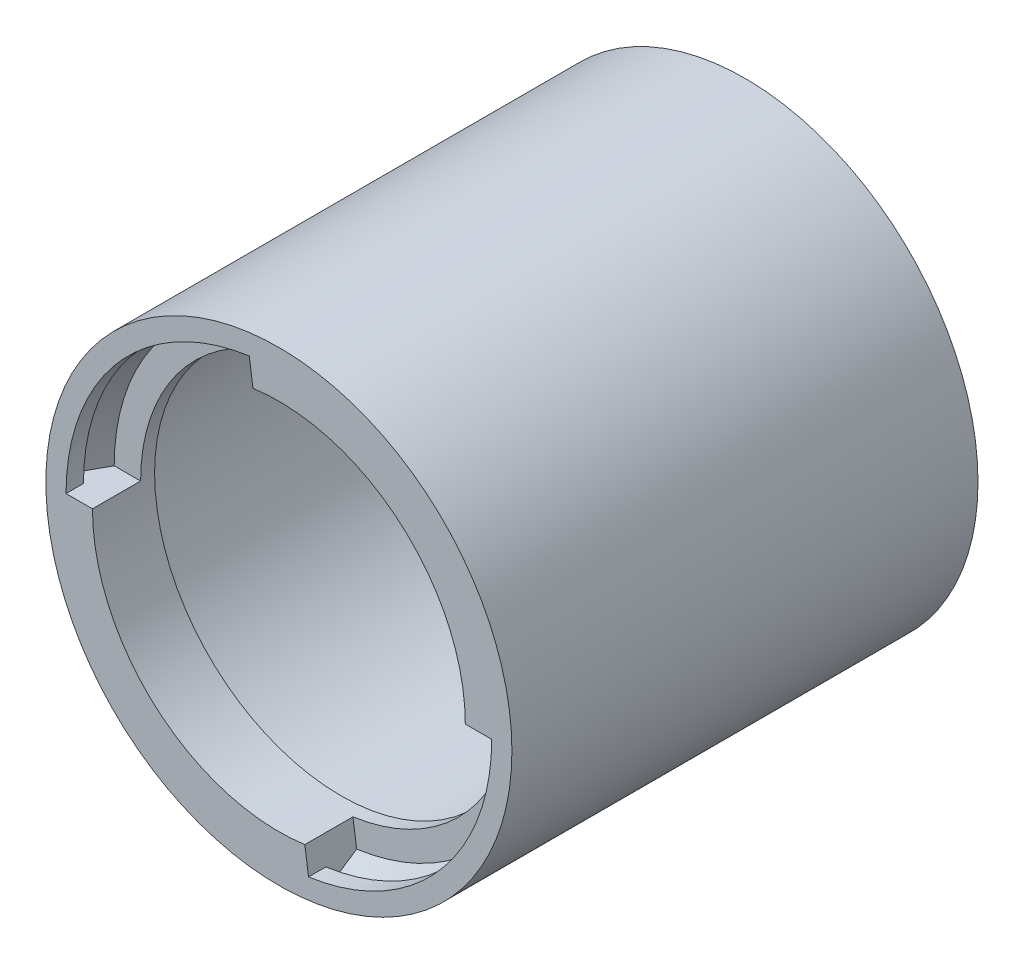
ISO-10303-21;
HEADER;
FILE_DESCRIPTION(('STEP AP214'),'2;1');
FILE_NAME('part.step','',(''),(''),'','','');
FILE_SCHEMA(('AUTOMOTIVE_DESIGN { 1 0 10303 214 1 1 1 1 }'));
ENDSEC;
DATA;
#1=APPLICATION_CONTEXT('core data for automotive mechanical design processes');
#2=APPLICATION_PROTOCOL_DEFINITION('international standard','automotive_design',2000,#1);
#3=PRODUCT_CONTEXT('',#1,'mechanical');
#4=PRODUCT('Part','Part','',(#3));
#5=PRODUCT_RELATED_PRODUCT_CATEGORY('part','',(#4));
#6=PRODUCT_DEFINITION_FORMATION('','',#4);
#7=PRODUCT_DEFINITION_CONTEXT('part definition',#1,'design');
#8=PRODUCT_DEFINITION('design','',#6,#7);
#9=PRODUCT_DEFINITION_SHAPE('','',#8);
#10=(LENGTH_UNIT() NAMED_UNIT(*) SI_UNIT(.MILLI.,.METRE.));
#11=(NAMED_UNIT(*) PLANE_ANGLE_UNIT() SI_UNIT($,.RADIAN.));
#12=(NAMED_UNIT(*) SI_UNIT($,.STERADIAN.) SOLID_ANGLE_UNIT());
#13=UNCERTAINTY_MEASURE_WITH_UNIT(LENGTH_MEASURE(1.E-05),#10,'distance_accuracy_value','');
#14=(GEOMETRIC_REPRESENTATION_CONTEXT(3) GLOBAL_UNCERTAINTY_ASSIGNED_CONTEXT((#13)) GLOBAL_UNIT_ASSIGNED_CONTEXT((#10,
#11,#12)) REPRESENTATION_CONTEXT('',''));
#15=CARTESIAN_POINT('',(0.,0.,0.));
#16=DIRECTION('',(0.,0.,1.));
#17=DIRECTION('',(1.,0.,0.));
#18=AXIS2_PLACEMENT_3D('',#15,#16,#17);
#19=CARTESIAN_POINT('',(0.,0.,26.));
#20=DIRECTION('',(0.,0.,1.));
#21=DIRECTION('',(1.,0.,0.));
#22=AXIS2_PLACEMENT_3D('',#19,#20,#21);
#23=CYLINDRICAL_SURFACE('',#22,12.);
#24=CARTESIAN_POINT('',(0.,0.,26.));
#25=DIRECTION('',(0.,0.,1.));
#26=DIRECTION('',(1.,0.,0.));
#27=AXIS2_PLACEMENT_3D('',#24,#25,#26);
#28=CIRCLE('',#27,12.);
#29=CARTESIAN_POINT('',(12.,0.,26.));
#30=VERTEX_POINT('',#29);
#31=EDGE_CURVE('E247',#30,#30,#28,.T.);
#32=ORIENTED_EDGE('',*,*,#31,.F.);
#33=EDGE_LOOP('',(#32));
#34=FACE_BOUND('',#33,.T.);
#35=DIRECTION('',(0.,0.,1.));
#36=VECTOR('',#35,1.);
#37=CARTESIAN_POINT('',(12.,0.,26.));
#38=LINE('',#37,#36);
#39=CARTESIAN_POINT('',(12.,0.,30.));
#40=VERTEX_POINT('',#39);
#41=CARTESIAN_POINT('',(12.,0.,26.9));
#42=VERTEX_POINT('',#41);
#43=EDGE_CURVE('E197',#40,#42,#38,.F.);
#44=ORIENTED_EDGE('',*,*,#43,.F.);
#45=CARTESIAN_POINT('',(0.,0.,30.));
#46=DIRECTION('',(0.,0.,1.));
#47=DIRECTION('',(1.,0.,0.));
#48=AXIS2_PLACEMENT_3D('',#45,#46,#47);
#49=CIRCLE('',#48,12.);
#50=CARTESIAN_POINT('',(-1.67007721152075,11.8832168248989,30.));
#51=VERTEX_POINT('',#50);
#52=EDGE_CURVE('E153',#40,#51,#49,.T.);
#53=ORIENTED_EDGE('',*,*,#52,.T.);
#54=DIRECTION('',(0.,0.,1.));
#55=VECTOR('',#54,1.);
#56=CARTESIAN_POINT('',(-1.67007721152075,11.8832168248989,26.));
#57=LINE('',#56,#55);
#58=CARTESIAN_POINT('',(-1.67007721152075,11.8832168248989,26.9));
#59=VERTEX_POINT('',#58);
#60=EDGE_CURVE('E158',#59,#51,#57,.T.);
#61=ORIENTED_EDGE('',*,*,#60,.F.);
#62=CARTESIAN_POINT('',(0.,0.,26.9));
#63=DIRECTION('',(0.,0.,1.));
#64=DIRECTION('',(1.,0.,0.));
#65=AXIS2_PLACEMENT_3D('',#62,#63,#64);
#66=CIRCLE('',#65,12.);
#67=CARTESIAN_POINT('',(-12.,0.,26.9));
#68=VERTEX_POINT('',#67);
#69=EDGE_CURVE('E268',#68,#59,#66,.F.);
#70=ORIENTED_EDGE('',*,*,#69,.F.);
#71=DIRECTION('',(0.,0.,1.));
#72=VECTOR('',#71,1.);
#73=CARTESIAN_POINT('',(-12.,0.,26.));
#74=LINE('',#73,#72);
#75=CARTESIAN_POINT('',(-12.,0.,30.));
#76=VERTEX_POINT('',#75);
#77=EDGE_CURVE('E274',#68,#76,#74,.T.);
#78=ORIENTED_EDGE('',*,*,#77,.T.);
#79=CARTESIAN_POINT('',(1.67007721152067,-11.8832168248989,30.));
#80=VERTEX_POINT('',#79);
#81=EDGE_CURVE('E252',#76,#80,#49,.T.);
#82=ORIENTED_EDGE('',*,*,#81,.T.);
#83=DIRECTION('',(0.,0.,1.));
#84=VECTOR('',#83,1.);
#85=CARTESIAN_POINT('',(1.67007721152068,-11.8832168248989,26.));
#86=LINE('',#85,#84);
#87=CARTESIAN_POINT('',(1.67007721152067,-11.8832168248989,26.9));
#88=VERTEX_POINT('',#87);
#89=EDGE_CURVE('E193',#80,#88,#86,.F.);
#90=ORIENTED_EDGE('',*,*,#89,.T.);
#91=CARTESIAN_POINT('',(0.,0.,26.9));
#92=DIRECTION('',(0.,0.,1.));
#93=DIRECTION('',(1.,0.,0.));
#94=AXIS2_PLACEMENT_3D('',#91,#92,#93);
#95=CIRCLE('',#94,12.);
#96=EDGE_CURVE('E11',#42,#88,#95,.F.);
#97=ORIENTED_EDGE('',*,*,#96,.F.);
#98=EDGE_LOOP('',(#44,#53,#61,#70,#78,#82,#90,#97));
#99=FACE_BOUND('',#98,.T.);
#100=ADVANCED_FACE('F43',(#34,#99),#23,.F.);
#101=CARTESIAN_POINT('',(0.,0.,30.));
#102=DIRECTION('',(0.,0.,-1.));
#103=DIRECTION('',(-1.,0.,0.));
#104=AXIS2_PLACEMENT_3D('',#101,#102,#103);
#105=CYLINDRICAL_SURFACE('',#104,13.5);
#106=CARTESIAN_POINT('',(0.,0.,0.));
#107=DIRECTION('',(0.,0.,1.));
#108=DIRECTION('',(1.,0.,0.));
#109=AXIS2_PLACEMENT_3D('',#106,#107,#108);
#110=CIRCLE('',#109,13.5);
#111=CARTESIAN_POINT('',(13.5,0.,0.));
#112=VERTEX_POINT('',#111);
#113=EDGE_CURVE('E259',#112,#112,#110,.T.);
#114=ORIENTED_EDGE('',*,*,#113,.F.);
#115=EDGE_LOOP('',(#114));
#116=FACE_BOUND('',#115,.T.);
#117=CARTESIAN_POINT('',(0.,0.,26.));
#118=DIRECTION('',(0.,0.,1.));
#119=DIRECTION('',(1.,0.,0.));
#120=AXIS2_PLACEMENT_3D('',#117,#118,#119);
#121=CIRCLE('',#120,13.5);
#122=CARTESIAN_POINT('',(13.5,0.,26.));
#123=VERTEX_POINT('',#122);
#124=EDGE_CURVE('E251',#123,#123,#121,.T.);
#125=ORIENTED_EDGE('',*,*,#124,.T.);
#126=EDGE_LOOP('',(#125));
#127=FACE_BOUND('',#126,.T.);
#128=ADVANCED_FACE('F326',(#116,#127),#105,.F.);
#129=CARTESIAN_POINT('',(0.,0.,30.));
#130=DIRECTION('',(0.,0.,1.));
#131=DIRECTION('',(1.,0.,0.));
#132=AXIS2_PLACEMENT_3D('',#129,#130,#131);
#133=PLANE('',#132);
#134=ORIENTED_EDGE('',*,*,#52,.F.);
#135=DIRECTION('',(-1.,0.,0.));
#136=VECTOR('',#135,1.);
#137=CARTESIAN_POINT('',(11.7,0.,30.));
#138=LINE('',#137,#136);
#139=CARTESIAN_POINT('',(13.7,0.,30.));
#140=VERTEX_POINT('',#139);
#141=EDGE_CURVE('E52',#40,#140,#138,.F.);
#142=ORIENTED_EDGE('',*,*,#141,.T.);
#143=CARTESIAN_POINT('',(0.,0.,30.));
#144=DIRECTION('',(0.,0.,-1.));
#145=DIRECTION('',(1.,0.,0.));
#146=AXIS2_PLACEMENT_3D('',#143,#144,#145);
#147=CIRCLE('',#146,13.7);
#148=CARTESIAN_POINT('',(1.90667148315277,-13.5666725417595,30.));
#149=VERTEX_POINT('',#148);
#150=EDGE_CURVE('E142',#140,#149,#147,.T.);
#151=ORIENTED_EDGE('',*,*,#150,.T.);
#152=DIRECTION('',(-0.139173100960056,0.990268068741572,0.));
#153=VECTOR('',#152,1.);
#154=CARTESIAN_POINT('',(1.62832528123265,-11.5861364042764,30.));
#155=LINE('',#154,#153);
#156=EDGE_CURVE('E155',#80,#149,#155,.F.);
#157=ORIENTED_EDGE('',*,*,#156,.F.);
#158=ORIENTED_EDGE('',*,*,#81,.F.);
#159=DIRECTION('',(1.,0.,0.));
#160=VECTOR('',#159,1.);
#161=CARTESIAN_POINT('',(-11.7,0.,30.));
#162=LINE('',#161,#160);
#163=CARTESIAN_POINT('',(-13.7,0.,30.));
#164=VERTEX_POINT('',#163);
#165=EDGE_CURVE('E242',#164,#76,#162,.T.);
#166=ORIENTED_EDGE('',*,*,#165,.F.);
#167=CARTESIAN_POINT('',(0.,0.,30.));
#168=DIRECTION('',(0.,0.,1.));
#169=DIRECTION('',(-0.139173100960063,0.990268068741571,0.));
#170=AXIS2_PLACEMENT_3D('',#167,#168,#169);
#171=CIRCLE('',#170,13.7);
#172=CARTESIAN_POINT('',(-1.90667148315286,13.5666725417595,30.));
#173=VERTEX_POINT('',#172);
#174=EDGE_CURVE('E238',#173,#164,#171,.T.);
#175=ORIENTED_EDGE('',*,*,#174,.F.);
#176=DIRECTION('',(0.139173100960063,-0.990268068741571,0.));
#177=VECTOR('',#176,1.);
#178=CARTESIAN_POINT('',(-1.62832528123273,11.5861364042764,30.));
#179=LINE('',#178,#177);
#180=EDGE_CURVE('E207',#173,#51,#179,.T.);
#181=ORIENTED_EDGE('',*,*,#180,.T.);
#182=EDGE_LOOP('',(#134,#142,#151,#157,#158,#166,#175,#181));
#183=FACE_BOUND('',#182,.T.);
#184=CARTESIAN_POINT('',(0.,0.,30.));
#185=DIRECTION('',(0.,0.,1.));
#186=DIRECTION('',(1.,0.,0.));
#187=AXIS2_PLACEMENT_3D('',#184,#185,#186);
#188=CIRCLE('',#187,15.);
#189=CARTESIAN_POINT('',(15.,0.,30.));
#190=VERTEX_POINT('',#189);
#191=EDGE_CURVE('E264',#190,#190,#188,.T.);
#192=ORIENTED_EDGE('',*,*,#191,.T.);
#193=EDGE_LOOP('',(#192));
#194=FACE_BOUND('',#193,.T.);
#195=ADVANCED_FACE('F150',(#183,#194),#133,.T.);
#196=CARTESIAN_POINT('',(0.,0.,0.));
#197=DIRECTION('',(0.,0.,1.));
#198=DIRECTION('',(1.,0.,0.));
#199=AXIS2_PLACEMENT_3D('',#196,#197,#198);
#200=PLANE('',#199);
#201=CARTESIAN_POINT('',(0.,0.,0.));
#202=DIRECTION('',(0.,0.,1.));
#203=DIRECTION('',(1.,0.,0.));
#204=AXIS2_PLACEMENT_3D('',#201,#202,#203);
#205=CIRCLE('',#204,15.);
#206=CARTESIAN_POINT('',(15.,0.,0.));
#207=VERTEX_POINT('',#206);
#208=EDGE_CURVE('E263',#207,#207,#205,.T.);
#209=ORIENTED_EDGE('',*,*,#208,.F.);
#210=EDGE_LOOP('',(#209));
#211=FACE_BOUND('',#210,.T.);
#212=ORIENTED_EDGE('',*,*,#113,.T.);
#213=EDGE_LOOP('',(#212));
#214=FACE_BOUND('',#213,.T.);
#215=ADVANCED_FACE('F343',(#211,#214),#200,.F.);
#216=CARTESIAN_POINT('',(0.,0.,30.));
#217=DIRECTION('',(0.,0.,-1.));
#218=DIRECTION('',(-1.,0.,0.));
#219=AXIS2_PLACEMENT_3D('',#216,#217,#218);
#220=CYLINDRICAL_SURFACE('',#219,15.);
#221=ORIENTED_EDGE('',*,*,#191,.F.);
#222=EDGE_LOOP('',(#221));
#223=FACE_BOUND('',#222,.T.);
#224=ORIENTED_EDGE('',*,*,#208,.T.);
#225=EDGE_LOOP('',(#224));
#226=FACE_BOUND('',#225,.T.);
#227=ADVANCED_FACE('F45',(#223,#226),#220,.T.);
#228=CARTESIAN_POINT('',(0.,0.,26.));
#229=DIRECTION('',(0.,0.,1.));
#230=DIRECTION('',(1.,0.,0.));
#231=AXIS2_PLACEMENT_3D('',#228,#229,#230);
#232=PLANE('',#231);
#233=ORIENTED_EDGE('',*,*,#31,.T.);
#234=EDGE_LOOP('',(#233));
#235=FACE_BOUND('',#234,.T.);
#236=ORIENTED_EDGE('',*,*,#124,.F.);
#237=EDGE_LOOP('',(#236));
#238=FACE_BOUND('',#237,.T.);
#239=ADVANCED_FACE('F338',(#235,#238),#232,.F.);
#240=CARTESIAN_POINT('',(0.,0.,0.));
#241=DIRECTION('',(-0.990268068741571,-0.139173100960063,0.));
#242=DIRECTION('',(0.,0.,-1.));
#243=AXIS2_PLACEMENT_3D('',#240,#241,#242);
#244=PLANE('',#243);
#245=ORIENTED_EDGE('',*,*,#60,.T.);
#246=ORIENTED_EDGE('',*,*,#180,.F.);
#247=DIRECTION('',(0.,0.,1.));
#248=VECTOR('',#247,1.);
#249=CARTESIAN_POINT('',(-1.90667148315286,13.5666725417595,30.));
#250=LINE('',#249,#248);
#251=CARTESIAN_POINT('',(-1.90667148315286,13.5666725417595,28.88));
#252=VERTEX_POINT('',#251);
#253=EDGE_CURVE('E225',#252,#173,#250,.T.);
#254=ORIENTED_EDGE('',*,*,#253,.F.);
#255=DIRECTION('',(0.103940678064232,-0.739576353622334,0.664998610980684));
#256=VECTOR('',#255,1.);
#257=CARTESIAN_POINT('',(-1.90667148315286,13.5666725417595,28.88));
#258=LINE('',#257,#256);
#259=CARTESIAN_POINT('',(-2.0082678468537,14.2895682319409,28.23));
#260=VERTEX_POINT('',#259);
#261=EDGE_CURVE('E214',#260,#252,#258,.T.);
#262=ORIENTED_EDGE('',*,*,#261,.F.);
#263=DIRECTION('',(-0.0669644600327571,0.476476891392898,0.876633066374456));
#264=VECTOR('',#263,1.);
#265=CARTESIAN_POINT('',(-2.0082678468537,14.2895682319409,28.23));
#266=LINE('',#265,#264);
#267=CARTESIAN_POINT('',(-1.90667148315286,13.5666725417595,26.9));
#268=VERTEX_POINT('',#267);
#269=EDGE_CURVE('E203',#268,#260,#266,.T.);
#270=ORIENTED_EDGE('',*,*,#269,.F.);
#271=DIRECTION('',(-0.139173100960063,0.990268068741571,0.));
#272=VECTOR('',#271,1.);
#273=CARTESIAN_POINT('',(-1.90667148315286,13.5666725417595,26.9));
#274=LINE('',#273,#272);
#275=EDGE_CURVE('E200',#59,#268,#274,.T.);
#276=ORIENTED_EDGE('',*,*,#275,.F.);
#277=EDGE_LOOP('',(#245,#246,#254,#262,#270,#276));
#278=FACE_BOUND('',#277,.T.);
#279=ADVANCED_FACE('F282',(#278),#244,.T.);
#280=CARTESIAN_POINT('',(0.,0.,0.));
#281=DIRECTION('',(0.,-1.,0.));
#282=DIRECTION('',(0.,0.,-1.));
#283=AXIS2_PLACEMENT_3D('',#280,#281,#282);
#284=PLANE('',#283);
#285=DIRECTION('',(-1.,0.,0.));
#286=VECTOR('',#285,1.);
#287=CARTESIAN_POINT('',(-13.7,0.,26.9));
#288=LINE('',#287,#286);
#289=CARTESIAN_POINT('',(-13.7,0.,26.9));
#290=VERTEX_POINT('',#289);
#291=EDGE_CURVE('E67',#68,#290,#288,.T.);
#292=ORIENTED_EDGE('',*,*,#291,.T.);
#293=DIRECTION('',(-0.481159502596507,0.,0.876633066374456));
#294=VECTOR('',#293,1.);
#295=CARTESIAN_POINT('',(-14.43,0.,28.23));
#296=LINE('',#295,#294);
#297=CARTESIAN_POINT('',(-14.43,0.,28.23));
#298=VERTEX_POINT('',#297);
#299=EDGE_CURVE('E210',#290,#298,#296,.T.);
#300=ORIENTED_EDGE('',*,*,#299,.T.);
#301=DIRECTION('',(0.746844593870613,0.,0.664998610980684));
#302=VECTOR('',#301,1.);
#303=CARTESIAN_POINT('',(-13.7,0.,28.88));
#304=LINE('',#303,#302);
#305=CARTESIAN_POINT('',(-13.7,0.,28.88));
#306=VERTEX_POINT('',#305);
#307=EDGE_CURVE('E221',#298,#306,#304,.T.);
#308=ORIENTED_EDGE('',*,*,#307,.T.);
#309=DIRECTION('',(0.,0.,1.));
#310=VECTOR('',#309,1.);
#311=CARTESIAN_POINT('',(-13.7,0.,30.));
#312=LINE('',#311,#310);
#313=EDGE_CURVE('E232',#306,#164,#312,.T.);
#314=ORIENTED_EDGE('',*,*,#313,.T.);
#315=ORIENTED_EDGE('',*,*,#165,.T.);
#316=ORIENTED_EDGE('',*,*,#77,.F.);
#317=EDGE_LOOP('',(#292,#300,#308,#314,#315,#316));
#318=FACE_BOUND('',#317,.T.);
#319=ADVANCED_FACE('F371',(#318),#284,.F.);
#320=CARTESIAN_POINT('',(-1.90667148315286,13.5666725417595,26.9));
#321=DIRECTION('',(0.,0.,1.));
#322=DIRECTION('',(1.,0.,0.));
#323=AXIS2_PLACEMENT_3D('',#320,#321,#322);
#324=PLANE('',#323);
#325=ORIENTED_EDGE('',*,*,#69,.T.);
#326=ORIENTED_EDGE('',*,*,#275,.T.);
#327=CARTESIAN_POINT('',(0.,0.,26.9));
#328=DIRECTION('',(0.,0.,1.));
#329=DIRECTION('',(-0.139173100960063,0.990268068741571,0.));
#330=AXIS2_PLACEMENT_3D('',#327,#328,#329);
#331=CIRCLE('',#330,13.7);
#332=EDGE_CURVE('E206',#268,#290,#331,.T.);
#333=ORIENTED_EDGE('',*,*,#332,.T.);
#334=ORIENTED_EDGE('',*,*,#291,.F.);
#335=EDGE_LOOP('',(#325,#326,#333,#334));
#336=FACE_BOUND('',#335,.T.);
#337=ADVANCED_FACE('F301',(#336),#324,.T.);
#338=CARTESIAN_POINT('',(0.,0.,26.9));
#339=DIRECTION('',(0.,0.,1.));
#340=DIRECTION('',(1.,0.,0.));
#341=AXIS2_PLACEMENT_3D('',#338,#339,#340);
#342=CONICAL_SURFACE('',#341,13.7,0.501976910249397);
#343=CARTESIAN_POINT('',(0.,0.,28.23));
#344=DIRECTION('',(0.,0.,1.));
#345=DIRECTION('',(-0.139173100960063,0.990268068741571,0.));
#346=AXIS2_PLACEMENT_3D('',#343,#344,#345);
#347=CIRCLE('',#346,14.43);
#348=EDGE_CURVE('E217',#260,#298,#347,.T.);
#349=ORIENTED_EDGE('',*,*,#348,.T.);
#350=ORIENTED_EDGE('',*,*,#299,.F.);
#351=ORIENTED_EDGE('',*,*,#332,.F.);
#352=ORIENTED_EDGE('',*,*,#269,.T.);
#353=EDGE_LOOP('',(#349,#350,#351,#352));
#354=FACE_BOUND('',#353,.T.);
#355=ADVANCED_FACE('F299',(#354),#342,.F.);
#356=CARTESIAN_POINT('',(0.,0.,28.23));
#357=DIRECTION('',(0.,0.,-1.));
#358=DIRECTION('',(-1.,0.,0.));
#359=AXIS2_PLACEMENT_3D('',#356,#357,#358);
#360=CONICAL_SURFACE('',#359,14.43,0.843304368645554);
#361=CARTESIAN_POINT('',(0.,0.,28.88));
#362=DIRECTION('',(0.,0.,1.));
#363=DIRECTION('',(-0.139173100960063,0.990268068741571,0.));
#364=AXIS2_PLACEMENT_3D('',#361,#362,#363);
#365=CIRCLE('',#364,13.7);
#366=EDGE_CURVE('E228',#252,#306,#365,.T.);
#367=ORIENTED_EDGE('',*,*,#366,.T.);
#368=ORIENTED_EDGE('',*,*,#307,.F.);
#369=ORIENTED_EDGE('',*,*,#348,.F.);
#370=ORIENTED_EDGE('',*,*,#261,.T.);
#371=EDGE_LOOP('',(#367,#368,#369,#370));
#372=FACE_BOUND('',#371,.T.);
#373=ADVANCED_FACE('F295',(#372),#360,.F.);
#374=CARTESIAN_POINT('',(0.,0.,30.));
#375=DIRECTION('',(0.,0.,1.));
#376=DIRECTION('',(1.,0.,0.));
#377=AXIS2_PLACEMENT_3D('',#374,#375,#376);
#378=CYLINDRICAL_SURFACE('',#377,13.7);
#379=ORIENTED_EDGE('',*,*,#174,.T.);
#380=ORIENTED_EDGE('',*,*,#313,.F.);
#381=ORIENTED_EDGE('',*,*,#366,.F.);
#382=ORIENTED_EDGE('',*,*,#253,.T.);
#383=EDGE_LOOP('',(#379,#380,#381,#382));
#384=FACE_BOUND('',#383,.T.);
#385=ADVANCED_FACE('F291',(#384),#378,.F.);
#386=CARTESIAN_POINT('',(13.7,0.,26.9));
#387=DIRECTION('',(0.,0.,1.));
#388=DIRECTION('',(1.,0.,0.));
#389=AXIS2_PLACEMENT_3D('',#386,#387,#388);
#390=PLANE('',#389);
#391=ORIENTED_EDGE('',*,*,#96,.T.);
#392=DIRECTION('',(0.139173100960056,-0.990268068741572,0.));
#393=VECTOR('',#392,1.);
#394=CARTESIAN_POINT('',(1.90667148315277,-13.5666725417595,26.9));
#395=LINE('',#394,#393);
#396=CARTESIAN_POINT('',(1.90667148315277,-13.5666725417595,26.9));
#397=VERTEX_POINT('',#396);
#398=EDGE_CURVE('E186',#397,#88,#395,.F.);
#399=ORIENTED_EDGE('',*,*,#398,.F.);
#400=CARTESIAN_POINT('',(0.,0.,26.9));
#401=DIRECTION('',(0.,0.,-1.));
#402=DIRECTION('',(1.,0.,0.));
#403=AXIS2_PLACEMENT_3D('',#400,#401,#402);
#404=CIRCLE('',#403,13.7);
#405=CARTESIAN_POINT('',(13.7,0.,26.9));
#406=VERTEX_POINT('',#405);
#407=EDGE_CURVE('E182',#406,#397,#404,.T.);
#408=ORIENTED_EDGE('',*,*,#407,.F.);
#409=DIRECTION('',(1.,0.,0.));
#410=VECTOR('',#409,1.);
#411=CARTESIAN_POINT('',(13.7,0.,26.9));
#412=LINE('',#411,#410);
#413=EDGE_CURVE('E147',#406,#42,#412,.F.);
#414=ORIENTED_EDGE('',*,*,#413,.T.);
#415=EDGE_LOOP('',(#391,#399,#408,#414));
#416=FACE_BOUND('',#415,.T.);
#417=ADVANCED_FACE('F309',(#416),#390,.T.);
#418=CARTESIAN_POINT('',(0.,0.,0.));
#419=DIRECTION('',(0.,-1.,0.));
#420=DIRECTION('',(0.,0.,-1.));
#421=AXIS2_PLACEMENT_3D('',#418,#419,#420);
#422=PLANE('',#421);
#423=ORIENTED_EDGE('',*,*,#43,.T.);
#424=ORIENTED_EDGE('',*,*,#413,.F.);
#425=DIRECTION('',(0.481159502596507,0.,0.876633066374456));
#426=VECTOR('',#425,1.);
#427=CARTESIAN_POINT('',(14.43,0.,28.23));
#428=LINE('',#427,#426);
#429=CARTESIAN_POINT('',(14.43,0.,28.23));
#430=VERTEX_POINT('',#429);
#431=EDGE_CURVE('E169',#430,#406,#428,.F.);
#432=ORIENTED_EDGE('',*,*,#431,.F.);
#433=DIRECTION('',(-0.746844593870613,0.,0.664998610980684));
#434=VECTOR('',#433,1.);
#435=CARTESIAN_POINT('',(13.7,0.,28.88));
#436=LINE('',#435,#434);
#437=CARTESIAN_POINT('',(13.7,0.,28.88));
#438=VERTEX_POINT('',#437);
#439=EDGE_CURVE('E137',#438,#430,#436,.F.);
#440=ORIENTED_EDGE('',*,*,#439,.F.);
#441=DIRECTION('',(0.,0.,1.));
#442=VECTOR('',#441,1.);
#443=CARTESIAN_POINT('',(13.7,0.,30.));
#444=LINE('',#443,#442);
#445=EDGE_CURVE('E132',#140,#438,#444,.F.);
#446=ORIENTED_EDGE('',*,*,#445,.F.);
#447=ORIENTED_EDGE('',*,*,#141,.F.);
#448=EDGE_LOOP('',(#423,#424,#432,#440,#446,#447));
#449=FACE_BOUND('',#448,.T.);
#450=ADVANCED_FACE('F133',(#449),#422,.T.);
#451=CARTESIAN_POINT('',(0.,0.,0.));
#452=DIRECTION('',(-0.990268068741572,-0.139173100960056,0.));
#453=DIRECTION('',(0.,0.,-1.));
#454=AXIS2_PLACEMENT_3D('',#451,#452,#453);
#455=PLANE('',#454);
#456=ORIENTED_EDGE('',*,*,#156,.T.);
#457=DIRECTION('',(0.,0.,1.));
#458=VECTOR('',#457,1.);
#459=CARTESIAN_POINT('',(1.90667148315277,-13.5666725417595,30.));
#460=LINE('',#459,#458);
#461=CARTESIAN_POINT('',(1.90667148315277,-13.5666725417595,28.88));
#462=VERTEX_POINT('',#461);
#463=EDGE_CURVE('E59',#149,#462,#460,.F.);
#464=ORIENTED_EDGE('',*,*,#463,.T.);
#465=DIRECTION('',(-0.103940678064227,0.739576353622335,0.664998610980684));
#466=VECTOR('',#465,1.);
#467=CARTESIAN_POINT('',(1.90667148315277,-13.5666725417595,28.88));
#468=LINE('',#467,#466);
#469=CARTESIAN_POINT('',(2.00826784685361,-14.2895682319409,28.23));
#470=VERTEX_POINT('',#469);
#471=EDGE_CURVE('E166',#462,#470,#468,.F.);
#472=ORIENTED_EDGE('',*,*,#471,.T.);
#473=DIRECTION('',(0.0669644600327539,-0.476476891392898,0.876633066374456));
#474=VECTOR('',#473,1.);
#475=CARTESIAN_POINT('',(2.00826784685361,-14.2895682319409,28.23));
#476=LINE('',#475,#474);
#477=EDGE_CURVE('E176',#470,#397,#476,.F.);
#478=ORIENTED_EDGE('',*,*,#477,.T.);
#479=ORIENTED_EDGE('',*,*,#398,.T.);
#480=ORIENTED_EDGE('',*,*,#89,.F.);
#481=EDGE_LOOP('',(#456,#464,#472,#478,#479,#480));
#482=FACE_BOUND('',#481,.T.);
#483=ADVANCED_FACE('F304',(#482),#455,.F.);
#484=CARTESIAN_POINT('',(0.,0.,30.));
#485=DIRECTION('',(0.,0.,-1.));
#486=DIRECTION('',(-1.,0.,0.));
#487=AXIS2_PLACEMENT_3D('',#484,#485,#486);
#488=CYLINDRICAL_SURFACE('',#487,13.7);
#489=CARTESIAN_POINT('',(0.,0.,28.88));
#490=DIRECTION('',(0.,0.,-1.));
#491=DIRECTION('',(1.,0.,0.));
#492=AXIS2_PLACEMENT_3D('',#489,#490,#491);
#493=CIRCLE('',#492,13.7);
#494=EDGE_CURVE('E163',#438,#462,#493,.T.);
#495=ORIENTED_EDGE('',*,*,#494,.T.);
#496=ORIENTED_EDGE('',*,*,#463,.F.);
#497=ORIENTED_EDGE('',*,*,#150,.F.);
#498=ORIENTED_EDGE('',*,*,#445,.T.);
#499=EDGE_LOOP('',(#495,#496,#497,#498));
#500=FACE_BOUND('',#499,.T.);
#501=ADVANCED_FACE('F143',(#500),#488,.F.);
#502=CARTESIAN_POINT('',(0.,0.,28.88));
#503=DIRECTION('',(0.,0.,-1.));
#504=DIRECTION('',(-1.,0.,0.));
#505=AXIS2_PLACEMENT_3D('',#502,#503,#504);
#506=CONICAL_SURFACE('',#505,13.7,0.843304368645554);
#507=CARTESIAN_POINT('',(0.,0.,28.23));
#508=DIRECTION('',(0.,0.,-1.));
#509=DIRECTION('',(1.,0.,0.));
#510=AXIS2_PLACEMENT_3D('',#507,#508,#509);
#511=CIRCLE('',#510,14.43);
#512=EDGE_CURVE('E172',#430,#470,#511,.T.);
#513=ORIENTED_EDGE('',*,*,#512,.T.);
#514=ORIENTED_EDGE('',*,*,#471,.F.);
#515=ORIENTED_EDGE('',*,*,#494,.F.);
#516=ORIENTED_EDGE('',*,*,#439,.T.);
#517=EDGE_LOOP('',(#513,#514,#515,#516));
#518=FACE_BOUND('',#517,.T.);
#519=ADVANCED_FACE('F316',(#518),#506,.F.);
#520=CARTESIAN_POINT('',(0.,0.,28.23));
#521=DIRECTION('',(0.,0.,1.));
#522=DIRECTION('',(1.,0.,0.));
#523=AXIS2_PLACEMENT_3D('',#520,#521,#522);
#524=CONICAL_SURFACE('',#523,14.43,0.501976910249397);
#525=ORIENTED_EDGE('',*,*,#407,.T.);
#526=ORIENTED_EDGE('',*,*,#477,.F.);
#527=ORIENTED_EDGE('',*,*,#512,.F.);
#528=ORIENTED_EDGE('',*,*,#431,.T.);
#529=EDGE_LOOP('',(#525,#526,#527,#528));
#530=FACE_BOUND('',#529,.T.);
#531=ADVANCED_FACE('F313',(#530),#524,.F.);
#532=CLOSED_SHELL('',(#100,#128,#195,#215,#227,#239,#279,#319,#337,#355,#373,#385,#417,#450,
#483,#501,#519,#531));
#533=MANIFOLD_SOLID_BREP('B2',#532);
#534=ADVANCED_BREP_SHAPE_REPRESENTATION('',(#18,#533),#14);
#535=SHAPE_DEFINITION_REPRESENTATION(#9,#534);
ENDSEC;
END-ISO-10303-21;
